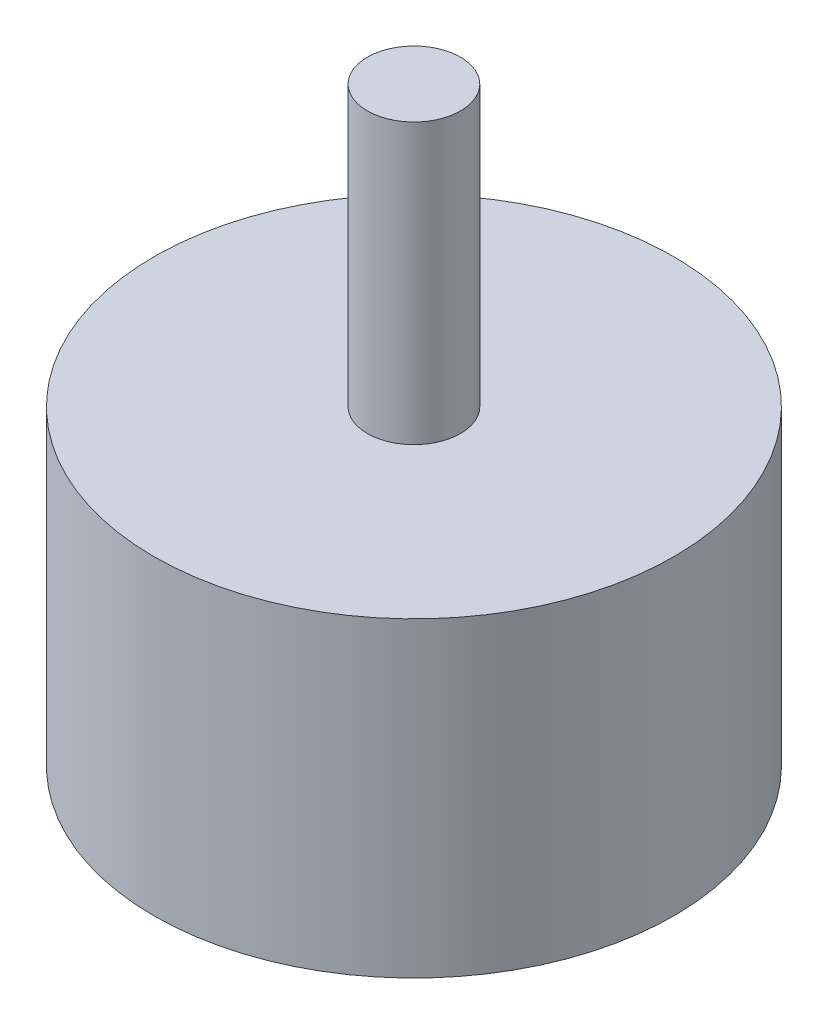
ISO-10303-21;
HEADER;
FILE_DESCRIPTION(('STEP AP214'),'2;1');
FILE_NAME('part.step','',(''),(''),'','','');
FILE_SCHEMA(('AUTOMOTIVE_DESIGN { 1 0 10303 214 1 1 1 1 }'));
ENDSEC;
DATA;
#1=APPLICATION_CONTEXT('core data for automotive mechanical design processes');
#2=APPLICATION_PROTOCOL_DEFINITION('international standard','automotive_design',2000,#1);
#3=PRODUCT_CONTEXT('',#1,'mechanical');
#4=PRODUCT('Part','Part','',(#3));
#5=PRODUCT_RELATED_PRODUCT_CATEGORY('part','',(#4));
#6=PRODUCT_DEFINITION_FORMATION('','',#4);
#7=PRODUCT_DEFINITION_CONTEXT('part definition',#1,'design');
#8=PRODUCT_DEFINITION('design','',#6,#7);
#9=PRODUCT_DEFINITION_SHAPE('','',#8);
#10=(LENGTH_UNIT() NAMED_UNIT(*) SI_UNIT(.MILLI.,.METRE.));
#11=(NAMED_UNIT(*) PLANE_ANGLE_UNIT() SI_UNIT($,.RADIAN.));
#12=(NAMED_UNIT(*) SI_UNIT($,.STERADIAN.) SOLID_ANGLE_UNIT());
#13=UNCERTAINTY_MEASURE_WITH_UNIT(LENGTH_MEASURE(1.E-05),#10,'distance_accuracy_value','');
#14=(GEOMETRIC_REPRESENTATION_CONTEXT(3) GLOBAL_UNCERTAINTY_ASSIGNED_CONTEXT((#13)) GLOBAL_UNIT_ASSIGNED_CONTEXT((#10,
#11,#12)) REPRESENTATION_CONTEXT('',''));
#15=CARTESIAN_POINT('',(0.,0.,0.));
#16=DIRECTION('',(0.,0.,1.));
#17=DIRECTION('',(1.,0.,0.));
#18=AXIS2_PLACEMENT_3D('',#15,#16,#17);
#19=CARTESIAN_POINT('',(0.,16.7,0.));
#20=DIRECTION('',(0.,-1.,0.));
#21=DIRECTION('',(0.,0.,-1.));
#22=AXIS2_PLACEMENT_3D('',#19,#20,#21);
#23=CYLINDRICAL_SURFACE('',#22,13.95);
#24=CARTESIAN_POINT('',(0.,16.7,0.));
#25=DIRECTION('',(0.,1.,0.));
#26=DIRECTION('',(0.,0.,1.));
#27=AXIS2_PLACEMENT_3D('',#24,#25,#26);
#28=CIRCLE('',#27,13.95);
#29=CARTESIAN_POINT('',(0.,16.7,13.95));
#30=VERTEX_POINT('',#29);
#31=EDGE_CURVE('E38',#30,#30,#28,.T.);
#32=ORIENTED_EDGE('',*,*,#31,.F.);
#33=EDGE_LOOP('',(#32));
#34=FACE_BOUND('',#33,.T.);
#35=CARTESIAN_POINT('',(0.,0.,0.));
#36=DIRECTION('',(0.,1.,0.));
#37=DIRECTION('',(0.,0.,1.));
#38=AXIS2_PLACEMENT_3D('',#35,#36,#37);
#39=CIRCLE('',#38,13.95);
#40=CARTESIAN_POINT('',(0.,0.,13.95));
#41=VERTEX_POINT('',#40);
#42=EDGE_CURVE('E34',#41,#41,#39,.T.);
#43=ORIENTED_EDGE('',*,*,#42,.T.);
#44=EDGE_LOOP('',(#43));
#45=FACE_BOUND('',#44,.T.);
#46=ADVANCED_FACE('F31',(#34,#45),#23,.T.);
#47=CARTESIAN_POINT('',(0.,16.7,0.));
#48=DIRECTION('',(0.,1.,0.));
#49=DIRECTION('',(0.,0.,1.));
#50=AXIS2_PLACEMENT_3D('',#47,#48,#49);
#51=PLANE('',#50);
#52=CARTESIAN_POINT('',(0.,16.7,0.));
#53=DIRECTION('',(0.,1.,0.));
#54=DIRECTION('',(0.,0.,1.));
#55=AXIS2_PLACEMENT_3D('',#52,#53,#54);
#56=CIRCLE('',#55,2.5);
#57=CARTESIAN_POINT('',(0.,16.7,2.5));
#58=VERTEX_POINT('',#57);
#59=EDGE_CURVE('E10',#58,#58,#56,.T.);
#60=ORIENTED_EDGE('',*,*,#59,.F.);
#61=EDGE_LOOP('',(#60));
#62=FACE_BOUND('',#61,.T.);
#63=ORIENTED_EDGE('',*,*,#31,.T.);
#64=EDGE_LOOP('',(#63));
#65=FACE_BOUND('',#64,.T.);
#66=ADVANCED_FACE('F55',(#62,#65),#51,.T.);
#67=CARTESIAN_POINT('',(0.,0.,0.));
#68=DIRECTION('',(0.,1.,0.));
#69=DIRECTION('',(0.,0.,1.));
#70=AXIS2_PLACEMENT_3D('',#67,#68,#69);
#71=PLANE('',#70);
#72=ORIENTED_EDGE('',*,*,#42,.F.);
#73=EDGE_LOOP('',(#72));
#74=FACE_BOUND('',#73,.T.);
#75=ADVANCED_FACE('F52',(#74),#71,.F.);
#76=CARTESIAN_POINT('',(0.,31.7,0.));
#77=DIRECTION('',(0.,-1.,0.));
#78=DIRECTION('',(0.,0.,-1.));
#79=AXIS2_PLACEMENT_3D('',#76,#77,#78);
#80=CYLINDRICAL_SURFACE('',#79,2.5);
#81=CARTESIAN_POINT('',(0.,31.7,0.));
#82=DIRECTION('',(0.,1.,0.));
#83=DIRECTION('',(0.,0.,1.));
#84=AXIS2_PLACEMENT_3D('',#81,#82,#83);
#85=CIRCLE('',#84,2.5);
#86=CARTESIAN_POINT('',(0.,31.7,2.5));
#87=VERTEX_POINT('',#86);
#88=EDGE_CURVE('E44',#87,#87,#85,.T.);
#89=ORIENTED_EDGE('',*,*,#88,.F.);
#90=EDGE_LOOP('',(#89));
#91=FACE_BOUND('',#90,.T.);
#92=ORIENTED_EDGE('',*,*,#59,.T.);
#93=EDGE_LOOP('',(#92));
#94=FACE_BOUND('',#93,.T.);
#95=ADVANCED_FACE('F54',(#91,#94),#80,.T.);
#96=CARTESIAN_POINT('',(0.,31.7,0.));
#97=DIRECTION('',(0.,1.,0.));
#98=DIRECTION('',(0.,0.,1.));
#99=AXIS2_PLACEMENT_3D('',#96,#97,#98);
#100=PLANE('',#99);
#101=ORIENTED_EDGE('',*,*,#88,.T.);
#102=EDGE_LOOP('',(#101));
#103=FACE_BOUND('',#102,.T.);
#104=ADVANCED_FACE('F60',(#103),#100,.T.);
#105=CLOSED_SHELL('',(#46,#66,#75,#95,#104));
#106=MANIFOLD_SOLID_BREP('B2',#105);
#107=ADVANCED_BREP_SHAPE_REPRESENTATION('',(#18,#106),#14);
#108=SHAPE_DEFINITION_REPRESENTATION(#9,#107);
ENDSEC;
END-ISO-10303-21;
